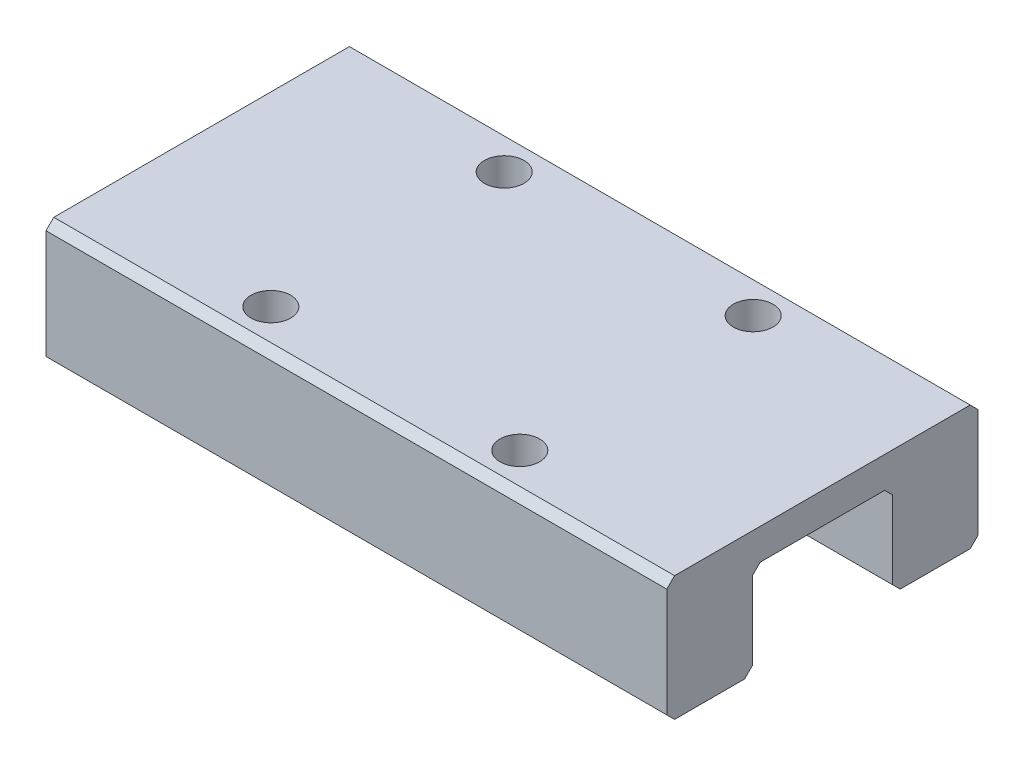
ISO-10303-21;
HEADER;
FILE_DESCRIPTION(('STEP AP214'),'2;1');
FILE_NAME('part.step','',(''),(''),'','','');
FILE_SCHEMA(('AUTOMOTIVE_DESIGN { 1 0 10303 214 1 1 1 1 }'));
ENDSEC;
DATA;
#1=APPLICATION_CONTEXT('core data for automotive mechanical design processes');
#2=APPLICATION_PROTOCOL_DEFINITION('international standard','automotive_design',2000,#1);
#3=PRODUCT_CONTEXT('',#1,'mechanical');
#4=PRODUCT('Part','Part','',(#3));
#5=PRODUCT_RELATED_PRODUCT_CATEGORY('part','',(#4));
#6=PRODUCT_DEFINITION_FORMATION('','',#4);
#7=PRODUCT_DEFINITION_CONTEXT('part definition',#1,'design');
#8=PRODUCT_DEFINITION('design','',#6,#7);
#9=PRODUCT_DEFINITION_SHAPE('','',#8);
#10=(LENGTH_UNIT() NAMED_UNIT(*) SI_UNIT(.MILLI.,.METRE.));
#11=(NAMED_UNIT(*) PLANE_ANGLE_UNIT() SI_UNIT($,.RADIAN.));
#12=(NAMED_UNIT(*) SI_UNIT($,.STERADIAN.) SOLID_ANGLE_UNIT());
#13=UNCERTAINTY_MEASURE_WITH_UNIT(LENGTH_MEASURE(1.E-05),#10,'distance_accuracy_value','');
#14=(GEOMETRIC_REPRESENTATION_CONTEXT(3) GLOBAL_UNCERTAINTY_ASSIGNED_CONTEXT((#13)) GLOBAL_UNIT_ASSIGNED_CONTEXT((#10,
#11,#12)) REPRESENTATION_CONTEXT('',''));
#15=CARTESIAN_POINT('',(0.,0.,0.));
#16=DIRECTION('',(0.,0.,1.));
#17=DIRECTION('',(1.,0.,0.));
#18=AXIS2_PLACEMENT_3D('',#15,#16,#17);
#19=CARTESIAN_POINT('',(39.9,-5.99999999999997,4.50000000000001));
#20=DIRECTION('',(0.,1.,0.));
#21=DIRECTION('',(0.,0.,1.));
#22=AXIS2_PLACEMENT_3D('',#19,#20,#21);
#23=PLANE('',#22);
#24=DIRECTION('',(0.,0.,-1.));
#25=VECTOR('',#24,1.);
#26=CARTESIAN_POINT('',(39.9,-5.99999999999997,4.50000000000001));
#27=LINE('',#26,#25);
#28=CARTESIAN_POINT('',(39.9,-5.99999999999998,9.50000000000002));
#29=VERTEX_POINT('',#28);
#30=CARTESIAN_POINT('',(39.9,-5.99999999999997,5.00000000000001));
#31=VERTEX_POINT('',#30);
#32=EDGE_CURVE('E198',#29,#31,#27,.T.);
#33=ORIENTED_EDGE('',*,*,#32,.F.);
#34=DIRECTION('',(-1.,0.,0.));
#35=VECTOR('',#34,1.);
#36=CARTESIAN_POINT('',(39.9,-5.99999999999998,9.50000000000002));
#37=LINE('',#36,#35);
#38=CARTESIAN_POINT('',(0.,-5.99999999999998,9.50000000000002));
#39=VERTEX_POINT('',#38);
#40=EDGE_CURVE('E239',#29,#39,#37,.T.);
#41=ORIENTED_EDGE('',*,*,#40,.T.);
#42=DIRECTION('',(0.,0.,-1.));
#43=VECTOR('',#42,1.);
#44=CARTESIAN_POINT('',(0.,-5.99999999999997,4.50000000000001));
#45=LINE('',#44,#43);
#46=CARTESIAN_POINT('',(0.,-5.99999999999997,5.00000000000001));
#47=VERTEX_POINT('',#46);
#48=EDGE_CURVE('E184',#39,#47,#45,.T.);
#49=ORIENTED_EDGE('',*,*,#48,.T.);
#50=DIRECTION('',(1.,0.,0.));
#51=VECTOR('',#50,1.);
#52=CARTESIAN_POINT('',(39.9,-5.99999999999997,5.00000000000001));
#53=LINE('',#52,#51);
#54=EDGE_CURVE('E237',#47,#31,#53,.T.);
#55=ORIENTED_EDGE('',*,*,#54,.T.);
#56=EDGE_LOOP('',(#33,#41,#49,#55));
#57=FACE_BOUND('',#56,.T.);
#58=ADVANCED_FACE('F37',(#57),#23,.F.);
#59=CARTESIAN_POINT('',(39.9,0.,4.50000000000001));
#60=DIRECTION('',(0.,0.,1.));
#61=DIRECTION('',(1.,0.,0.));
#62=AXIS2_PLACEMENT_3D('',#59,#60,#61);
#63=PLANE('',#62);
#64=DIRECTION('',(0.,1.,0.));
#65=VECTOR('',#64,1.);
#66=CARTESIAN_POINT('',(0.,0.,4.50000000000001));
#67=LINE('',#66,#65);
#68=CARTESIAN_POINT('',(0.,-5.49999999999997,4.50000000000001));
#69=VERTEX_POINT('',#68);
#70=CARTESIAN_POINT('',(0.,-0.499999999999967,4.50000000000001));
#71=VERTEX_POINT('',#70);
#72=EDGE_CURVE('E179',#69,#71,#67,.T.);
#73=ORIENTED_EDGE('',*,*,#72,.T.);
#74=DIRECTION('',(1.,0.,0.));
#75=VECTOR('',#74,1.);
#76=CARTESIAN_POINT('',(39.9,-0.499999999999967,4.50000000000001));
#77=LINE('',#76,#75);
#78=CARTESIAN_POINT('',(39.9,-0.499999999999967,4.50000000000001));
#79=VERTEX_POINT('',#78);
#80=EDGE_CURVE('E156',#71,#79,#77,.T.);
#81=ORIENTED_EDGE('',*,*,#80,.T.);
#82=DIRECTION('',(0.,1.,0.));
#83=VECTOR('',#82,1.);
#84=CARTESIAN_POINT('',(39.9,0.,4.50000000000001));
#85=LINE('',#84,#83);
#86=CARTESIAN_POINT('',(39.9,-5.49999999999997,4.50000000000001));
#87=VERTEX_POINT('',#86);
#88=EDGE_CURVE('E260',#87,#79,#85,.T.);
#89=ORIENTED_EDGE('',*,*,#88,.F.);
#90=DIRECTION('',(-1.,0.,0.));
#91=VECTOR('',#90,1.);
#92=CARTESIAN_POINT('',(39.9,-5.49999999999997,4.50000000000001));
#93=LINE('',#92,#91);
#94=EDGE_CURVE('E172',#87,#69,#93,.T.);
#95=ORIENTED_EDGE('',*,*,#94,.T.);
#96=EDGE_LOOP('',(#73,#81,#89,#95));
#97=FACE_BOUND('',#96,.T.);
#98=ADVANCED_FACE('F374',(#97),#63,.F.);
#99=CARTESIAN_POINT('',(39.9,0.,4.50000000000001));
#100=DIRECTION('',(0.,1.,0.));
#101=DIRECTION('',(0.,0.,1.));
#102=AXIS2_PLACEMENT_3D('',#99,#100,#101);
#103=PLANE('',#102);
#104=DIRECTION('',(0.,0.,-1.));
#105=VECTOR('',#104,1.);
#106=CARTESIAN_POINT('',(39.9,0.,4.50000000000001));
#107=LINE('',#106,#105);
#108=CARTESIAN_POINT('',(39.9,0.,4.00000000000001));
#109=VERTEX_POINT('',#108);
#110=CARTESIAN_POINT('',(39.9,0.,-4.00000000000001));
#111=VERTEX_POINT('',#110);
#112=EDGE_CURVE('E171',#109,#111,#107,.T.);
#113=ORIENTED_EDGE('',*,*,#112,.F.);
#114=DIRECTION('',(-1.,0.,0.));
#115=VECTOR('',#114,1.);
#116=CARTESIAN_POINT('',(0.,0.,4.00000000000001));
#117=LINE('',#116,#115);
#118=CARTESIAN_POINT('',(0.,0.,4.00000000000001));
#119=VERTEX_POINT('',#118);
#120=EDGE_CURVE('E155',#109,#119,#117,.T.);
#121=ORIENTED_EDGE('',*,*,#120,.T.);
#122=DIRECTION('',(0.,0.,-1.));
#123=VECTOR('',#122,1.);
#124=CARTESIAN_POINT('',(0.,0.,4.50000000000001));
#125=LINE('',#124,#123);
#126=CARTESIAN_POINT('',(0.,0.,-4.00000000000001));
#127=VERTEX_POINT('',#126);
#128=EDGE_CURVE('E168',#119,#127,#125,.T.);
#129=ORIENTED_EDGE('',*,*,#128,.T.);
#130=DIRECTION('',(1.,0.,0.));
#131=VECTOR('',#130,1.);
#132=CARTESIAN_POINT('',(39.9,0.,-4.00000000000001));
#133=LINE('',#132,#131);
#134=EDGE_CURVE('E173',#127,#111,#133,.T.);
#135=ORIENTED_EDGE('',*,*,#134,.T.);
#136=EDGE_LOOP('',(#113,#121,#129,#135));
#137=FACE_BOUND('',#136,.T.);
#138=ADVANCED_FACE('F167',(#137),#103,.F.);
#139=CARTESIAN_POINT('',(39.9,0.,-4.50000000000001));
#140=DIRECTION('',(0.,0.,-1.));
#141=DIRECTION('',(-1.,0.,0.));
#142=AXIS2_PLACEMENT_3D('',#139,#140,#141);
#143=PLANE('',#142);
#144=DIRECTION('',(0.,-1.,0.));
#145=VECTOR('',#144,1.);
#146=CARTESIAN_POINT('',(0.,0.,-4.50000000000001));
#147=LINE('',#146,#145);
#148=CARTESIAN_POINT('',(0.,-0.499999999999999,-4.50000000000001));
#149=VERTEX_POINT('',#148);
#150=CARTESIAN_POINT('',(0.,-5.5,-4.50000000000001));
#151=VERTEX_POINT('',#150);
#152=EDGE_CURVE('E178',#149,#151,#147,.T.);
#153=ORIENTED_EDGE('',*,*,#152,.T.);
#154=DIRECTION('',(1.,0.,0.));
#155=VECTOR('',#154,1.);
#156=CARTESIAN_POINT('',(39.9,-5.5,-4.50000000000001));
#157=LINE('',#156,#155);
#158=CARTESIAN_POINT('',(39.9,-5.5,-4.50000000000001));
#159=VERTEX_POINT('',#158);
#160=EDGE_CURVE('E224',#151,#159,#157,.T.);
#161=ORIENTED_EDGE('',*,*,#160,.T.);
#162=DIRECTION('',(0.,-1.,0.));
#163=VECTOR('',#162,1.);
#164=CARTESIAN_POINT('',(39.9,0.,-4.50000000000001));
#165=LINE('',#164,#163);
#166=CARTESIAN_POINT('',(39.9,-0.499999999999999,-4.50000000000001));
#167=VERTEX_POINT('',#166);
#168=EDGE_CURVE('E266',#167,#159,#165,.T.);
#169=ORIENTED_EDGE('',*,*,#168,.F.);
#170=DIRECTION('',(-1.,0.,0.));
#171=VECTOR('',#170,1.);
#172=CARTESIAN_POINT('',(0.,-0.499999999999999,-4.50000000000001));
#173=LINE('',#172,#171);
#174=EDGE_CURVE('E221',#167,#149,#173,.T.);
#175=ORIENTED_EDGE('',*,*,#174,.T.);
#176=EDGE_LOOP('',(#153,#161,#169,#175));
#177=FACE_BOUND('',#176,.T.);
#178=ADVANCED_FACE('F357',(#177),#143,.F.);
#179=CARTESIAN_POINT('',(39.9,-6.,-4.50000000000001));
#180=DIRECTION('',(0.,1.,0.));
#181=DIRECTION('',(0.,0.,1.));
#182=AXIS2_PLACEMENT_3D('',#179,#180,#181);
#183=PLANE('',#182);
#184=DIRECTION('',(0.,0.,-1.));
#185=VECTOR('',#184,1.);
#186=CARTESIAN_POINT('',(39.9,-6.,-4.50000000000001));
#187=LINE('',#186,#185);
#188=CARTESIAN_POINT('',(39.9,-6.,-5.00000000000001));
#189=VERTEX_POINT('',#188);
#190=CARTESIAN_POINT('',(39.9,-6.,-9.50000000000001));
#191=VERTEX_POINT('',#190);
#192=EDGE_CURVE('E272',#189,#191,#187,.T.);
#193=ORIENTED_EDGE('',*,*,#192,.F.);
#194=DIRECTION('',(-1.,0.,0.));
#195=VECTOR('',#194,1.);
#196=CARTESIAN_POINT('',(39.9,-6.,-5.00000000000001));
#197=LINE('',#196,#195);
#198=CARTESIAN_POINT('',(0.,-6.,-5.00000000000001));
#199=VERTEX_POINT('',#198);
#200=EDGE_CURVE('E206',#189,#199,#197,.T.);
#201=ORIENTED_EDGE('',*,*,#200,.T.);
#202=DIRECTION('',(0.,0.,-1.));
#203=VECTOR('',#202,1.);
#204=CARTESIAN_POINT('',(0.,-6.,-4.50000000000001));
#205=LINE('',#204,#203);
#206=CARTESIAN_POINT('',(0.,-6.,-9.50000000000001));
#207=VERTEX_POINT('',#206);
#208=EDGE_CURVE('E182',#199,#207,#205,.T.);
#209=ORIENTED_EDGE('',*,*,#208,.T.);
#210=DIRECTION('',(1.,0.,0.));
#211=VECTOR('',#210,1.);
#212=CARTESIAN_POINT('',(39.9,-6.,-9.50000000000001));
#213=LINE('',#212,#211);
#214=EDGE_CURVE('E204',#207,#191,#213,.T.);
#215=ORIENTED_EDGE('',*,*,#214,.T.);
#216=EDGE_LOOP('',(#193,#201,#209,#215));
#217=FACE_BOUND('',#216,.T.);
#218=ADVANCED_FACE('F350',(#217),#183,.F.);
#219=CARTESIAN_POINT('',(39.9,-6.00000000000001,-10.));
#220=DIRECTION('',(0.,0.,1.));
#221=DIRECTION('',(1.,0.,0.));
#222=AXIS2_PLACEMENT_3D('',#219,#220,#221);
#223=PLANE('',#222);
#224=DIRECTION('',(0.,1.,0.));
#225=VECTOR('',#224,1.);
#226=CARTESIAN_POINT('',(39.9,-6.00000000000001,-10.));
#227=LINE('',#226,#225);
#228=CARTESIAN_POINT('',(39.9,-5.5,-10.));
#229=VERTEX_POINT('',#228);
#230=CARTESIAN_POINT('',(39.9,1.49999999999999,-10.));
#231=VERTEX_POINT('',#230);
#232=EDGE_CURVE('E275',#229,#231,#227,.T.);
#233=ORIENTED_EDGE('',*,*,#232,.F.);
#234=DIRECTION('',(-1.,0.,0.));
#235=VECTOR('',#234,1.);
#236=CARTESIAN_POINT('',(39.9,-5.5,-10.));
#237=LINE('',#236,#235);
#238=CARTESIAN_POINT('',(0.,-5.5,-10.));
#239=VERTEX_POINT('',#238);
#240=EDGE_CURVE('E248',#229,#239,#237,.T.);
#241=ORIENTED_EDGE('',*,*,#240,.T.);
#242=DIRECTION('',(0.,1.,0.));
#243=VECTOR('',#242,1.);
#244=CARTESIAN_POINT('',(0.,-6.00000000000001,-10.));
#245=LINE('',#244,#243);
#246=CARTESIAN_POINT('',(0.,1.49999999999999,-10.));
#247=VERTEX_POINT('',#246);
#248=EDGE_CURVE('E190',#239,#247,#245,.T.);
#249=ORIENTED_EDGE('',*,*,#248,.T.);
#250=DIRECTION('',(1.,0.,0.));
#251=VECTOR('',#250,1.);
#252=CARTESIAN_POINT('',(39.9,1.49999999999999,-10.));
#253=LINE('',#252,#251);
#254=EDGE_CURVE('E246',#247,#231,#253,.T.);
#255=ORIENTED_EDGE('',*,*,#254,.T.);
#256=EDGE_LOOP('',(#233,#241,#249,#255));
#257=FACE_BOUND('',#256,.T.);
#258=ADVANCED_FACE('F324',(#257),#223,.F.);
#259=CARTESIAN_POINT('',(39.9,2.,-10.));
#260=DIRECTION('',(0.,-1.,0.));
#261=DIRECTION('',(0.,0.,-1.));
#262=AXIS2_PLACEMENT_3D('',#259,#260,#261);
#263=PLANE('',#262);
#264=CARTESIAN_POINT('',(11.95,2.00000000000002,7.5));
#265=DIRECTION('',(0.,1.,0.));
#266=DIRECTION('',(0.,0.,-1.));
#267=AXIS2_PLACEMENT_3D('',#264,#265,#266);
#268=CIRCLE('',#267,1.275);
#269=CARTESIAN_POINT('',(11.95,2.00000000000002,6.225));
#270=VERTEX_POINT('',#269);
#271=EDGE_CURVE('E305',#270,#270,#268,.T.);
#272=ORIENTED_EDGE('',*,*,#271,.F.);
#273=EDGE_LOOP('',(#272));
#274=FACE_BOUND('',#273,.T.);
#275=CARTESIAN_POINT('',(27.95,2.00000000000002,7.5));
#276=DIRECTION('',(0.,1.,0.));
#277=DIRECTION('',(0.,0.,1.));
#278=AXIS2_PLACEMENT_3D('',#275,#276,#277);
#279=CIRCLE('',#278,1.275);
#280=CARTESIAN_POINT('',(27.95,2.00000000000002,8.775));
#281=VERTEX_POINT('',#280);
#282=EDGE_CURVE('E299',#281,#281,#279,.T.);
#283=ORIENTED_EDGE('',*,*,#282,.F.);
#284=EDGE_LOOP('',(#283));
#285=FACE_BOUND('',#284,.T.);
#286=CARTESIAN_POINT('',(27.95,2.,-7.5));
#287=DIRECTION('',(0.,1.,0.));
#288=DIRECTION('',(0.,0.,-1.));
#289=AXIS2_PLACEMENT_3D('',#286,#287,#288);
#290=CIRCLE('',#289,1.275);
#291=CARTESIAN_POINT('',(27.95,2.,-8.775));
#292=VERTEX_POINT('',#291);
#293=EDGE_CURVE('E293',#292,#292,#290,.T.);
#294=ORIENTED_EDGE('',*,*,#293,.F.);
#295=EDGE_LOOP('',(#294));
#296=FACE_BOUND('',#295,.T.);
#297=CARTESIAN_POINT('',(11.95,2.,-7.5));
#298=DIRECTION('',(0.,1.,0.));
#299=DIRECTION('',(0.,0.,1.));
#300=AXIS2_PLACEMENT_3D('',#297,#298,#299);
#301=CIRCLE('',#300,1.275);
#302=CARTESIAN_POINT('',(11.95,2.,-6.225));
#303=VERTEX_POINT('',#302);
#304=EDGE_CURVE('E286',#303,#303,#301,.T.);
#305=ORIENTED_EDGE('',*,*,#304,.F.);
#306=EDGE_LOOP('',(#305));
#307=FACE_BOUND('',#306,.T.);
#308=DIRECTION('',(0.,0.,1.));
#309=VECTOR('',#308,1.);
#310=CARTESIAN_POINT('',(39.9,2.,-10.));
#311=LINE('',#310,#309);
#312=CARTESIAN_POINT('',(39.9,2.,-9.5));
#313=VERTEX_POINT('',#312);
#314=CARTESIAN_POINT('',(39.9,2.00000000000002,9.50000000000001));
#315=VERTEX_POINT('',#314);
#316=EDGE_CURVE('E278',#313,#315,#311,.T.);
#317=ORIENTED_EDGE('',*,*,#316,.F.);
#318=DIRECTION('',(-1.,0.,0.));
#319=VECTOR('',#318,1.);
#320=CARTESIAN_POINT('',(39.9,2.,-9.5));
#321=LINE('',#320,#319);
#322=CARTESIAN_POINT('',(0.,2.,-9.5));
#323=VERTEX_POINT('',#322);
#324=EDGE_CURVE('E162',#313,#323,#321,.T.);
#325=ORIENTED_EDGE('',*,*,#324,.T.);
#326=DIRECTION('',(0.,0.,1.));
#327=VECTOR('',#326,1.);
#328=CARTESIAN_POINT('',(0.,2.,-10.));
#329=LINE('',#328,#327);
#330=CARTESIAN_POINT('',(0.,2.00000000000002,9.50000000000001));
#331=VERTEX_POINT('',#330);
#332=EDGE_CURVE('E193',#323,#331,#329,.T.);
#333=ORIENTED_EDGE('',*,*,#332,.T.);
#334=DIRECTION('',(1.,0.,0.));
#335=VECTOR('',#334,1.);
#336=CARTESIAN_POINT('',(39.9,2.00000000000002,9.50000000000001));
#337=LINE('',#336,#335);
#338=EDGE_CURVE('E251',#331,#315,#337,.T.);
#339=ORIENTED_EDGE('',*,*,#338,.T.);
#340=EDGE_LOOP('',(#317,#325,#333,#339));
#341=FACE_BOUND('',#340,.T.);
#342=ADVANCED_FACE('F320',(#274,#285,#296,#307,#341),#263,.F.);
#343=CARTESIAN_POINT('',(39.9,-5.99999999999998,10.));
#344=DIRECTION('',(0.,0.,-1.));
#345=DIRECTION('',(-1.,0.,0.));
#346=AXIS2_PLACEMENT_3D('',#343,#344,#345);
#347=PLANE('',#346);
#348=DIRECTION('',(0.,-1.,0.));
#349=VECTOR('',#348,1.);
#350=CARTESIAN_POINT('',(0.,-5.99999999999998,10.));
#351=LINE('',#350,#349);
#352=CARTESIAN_POINT('',(0.,1.50000000000002,10.));
#353=VERTEX_POINT('',#352);
#354=CARTESIAN_POINT('',(0.,-5.49999999999998,10.));
#355=VERTEX_POINT('',#354);
#356=EDGE_CURVE('E196',#353,#355,#351,.T.);
#357=ORIENTED_EDGE('',*,*,#356,.T.);
#358=DIRECTION('',(1.,0.,0.));
#359=VECTOR('',#358,1.);
#360=CARTESIAN_POINT('',(39.9,-5.49999999999998,10.));
#361=LINE('',#360,#359);
#362=CARTESIAN_POINT('',(39.9,-5.49999999999998,10.));
#363=VERTEX_POINT('',#362);
#364=EDGE_CURVE('E52',#355,#363,#361,.T.);
#365=ORIENTED_EDGE('',*,*,#364,.T.);
#366=DIRECTION('',(0.,-1.,0.));
#367=VECTOR('',#366,1.);
#368=CARTESIAN_POINT('',(39.9,-5.99999999999998,10.));
#369=LINE('',#368,#367);
#370=CARTESIAN_POINT('',(39.9,1.50000000000002,10.));
#371=VERTEX_POINT('',#370);
#372=EDGE_CURVE('E199',#371,#363,#369,.T.);
#373=ORIENTED_EDGE('',*,*,#372,.F.);
#374=DIRECTION('',(-1.,0.,0.));
#375=VECTOR('',#374,1.);
#376=CARTESIAN_POINT('',(39.9,1.50000000000002,10.));
#377=LINE('',#376,#375);
#378=EDGE_CURVE('E242',#371,#353,#377,.T.);
#379=ORIENTED_EDGE('',*,*,#378,.T.);
#380=EDGE_LOOP('',(#357,#365,#373,#379));
#381=FACE_BOUND('',#380,.T.);
#382=ADVANCED_FACE('F323',(#381),#347,.F.);
#383=CARTESIAN_POINT('',(39.9,-5.99999999999998,10.));
#384=DIRECTION('',(-1.,0.,0.));
#385=DIRECTION('',(0.,0.,1.));
#386=AXIS2_PLACEMENT_3D('',#383,#384,#385);
#387=PLANE('',#386);
#388=ORIENTED_EDGE('',*,*,#168,.T.);
#389=DIRECTION('',(0.,0.707106781186548,0.707106781186547));
#390=VECTOR('',#389,1.);
#391=CARTESIAN_POINT('',(39.9,-6.,-5.00000000000001));
#392=LINE('',#391,#390);
#393=EDGE_CURVE('E235',#159,#189,#392,.F.);
#394=ORIENTED_EDGE('',*,*,#393,.T.);
#395=ORIENTED_EDGE('',*,*,#192,.T.);
#396=DIRECTION('',(0.,-0.707106781186548,0.707106781186548));
#397=VECTOR('',#396,1.);
#398=CARTESIAN_POINT('',(39.9,-5.5,-10.));
#399=LINE('',#398,#397);
#400=EDGE_CURVE('E229',#191,#229,#399,.F.);
#401=ORIENTED_EDGE('',*,*,#400,.T.);
#402=ORIENTED_EDGE('',*,*,#232,.T.);
#403=DIRECTION('',(0.,-0.707106781186548,-0.707106781186547));
#404=VECTOR('',#403,1.);
#405=CARTESIAN_POINT('',(39.9,2.,-9.5));
#406=LINE('',#405,#404);
#407=EDGE_CURVE('E227',#231,#313,#406,.F.);
#408=ORIENTED_EDGE('',*,*,#407,.T.);
#409=ORIENTED_EDGE('',*,*,#316,.T.);
#410=DIRECTION('',(0.,0.707106781186547,-0.707106781186548));
#411=VECTOR('',#410,1.);
#412=CARTESIAN_POINT('',(39.9,1.50000000000002,10.));
#413=LINE('',#412,#411);
#414=EDGE_CURVE('E59',#315,#371,#413,.F.);
#415=ORIENTED_EDGE('',*,*,#414,.T.);
#416=ORIENTED_EDGE('',*,*,#372,.T.);
#417=DIRECTION('',(0.,0.707106781186548,0.707106781186548));
#418=VECTOR('',#417,1.);
#419=CARTESIAN_POINT('',(39.9,-5.99999999999998,9.50000000000002));
#420=LINE('',#419,#418);
#421=EDGE_CURVE('E233',#363,#29,#420,.F.);
#422=ORIENTED_EDGE('',*,*,#421,.T.);
#423=ORIENTED_EDGE('',*,*,#32,.T.);
#424=DIRECTION('',(0.,-0.707106781186548,0.707106781186548));
#425=VECTOR('',#424,1.);
#426=CARTESIAN_POINT('',(39.9,-5.49999999999997,4.50000000000001));
#427=LINE('',#426,#425);
#428=EDGE_CURVE('E231',#31,#87,#427,.F.);
#429=ORIENTED_EDGE('',*,*,#428,.T.);
#430=ORIENTED_EDGE('',*,*,#88,.T.);
#431=DIRECTION('',(0.,-0.707106781186543,0.707106781186552));
#432=VECTOR('',#431,1.);
#433=CARTESIAN_POINT('',(39.9,-5.99999999999994,10.));
#434=LINE('',#433,#432);
#435=EDGE_CURVE('E161',#79,#109,#434,.F.);
#436=ORIENTED_EDGE('',*,*,#435,.T.);
#437=ORIENTED_EDGE('',*,*,#112,.T.);
#438=DIRECTION('',(0.,0.707106781186552,0.707106781186543));
#439=VECTOR('',#438,1.);
#440=CARTESIAN_POINT('',(39.9,3.99999999999998,0.));
#441=LINE('',#440,#439);
#442=EDGE_CURVE('E11',#111,#167,#441,.F.);
#443=ORIENTED_EDGE('',*,*,#442,.T.);
#444=EDGE_LOOP('',(#388,#394,#395,#401,#402,#408,#409,#415,#416,#422,#423,#429,#430,#436,#437,#443));
#445=FACE_BOUND('',#444,.T.);
#446=ADVANCED_FACE('F257',(#445),#387,.F.);
#447=CARTESIAN_POINT('',(0.,-5.99999999999998,10.));
#448=DIRECTION('',(-1.,0.,0.));
#449=DIRECTION('',(0.,0.,1.));
#450=AXIS2_PLACEMENT_3D('',#447,#448,#449);
#451=PLANE('',#450);
#452=ORIENTED_EDGE('',*,*,#208,.F.);
#453=DIRECTION('',(0.,-0.707106781186548,-0.707106781186547));
#454=VECTOR('',#453,1.);
#455=CARTESIAN_POINT('',(0.,1.50000000000002,2.5));
#456=LINE('',#455,#454);
#457=EDGE_CURVE('E219',#199,#151,#456,.F.);
#458=ORIENTED_EDGE('',*,*,#457,.T.);
#459=ORIENTED_EDGE('',*,*,#152,.F.);
#460=DIRECTION('',(0.,-0.707106781186552,-0.707106781186543));
#461=VECTOR('',#460,1.);
#462=CARTESIAN_POINT('',(0.,-0.499999999999999,-4.50000000000001));
#463=LINE('',#462,#461);
#464=EDGE_CURVE('E45',#149,#127,#463,.F.);
#465=ORIENTED_EDGE('',*,*,#464,.T.);
#466=ORIENTED_EDGE('',*,*,#128,.F.);
#467=DIRECTION('',(0.,0.707106781186543,-0.707106781186552));
#468=VECTOR('',#467,1.);
#469=CARTESIAN_POINT('',(0.,0.,4.00000000000001));
#470=LINE('',#469,#468);
#471=EDGE_CURVE('E151',#119,#71,#470,.F.);
#472=ORIENTED_EDGE('',*,*,#471,.T.);
#473=ORIENTED_EDGE('',*,*,#72,.F.);
#474=DIRECTION('',(0.,0.707106781186548,-0.707106781186548));
#475=VECTOR('',#474,1.);
#476=CARTESIAN_POINT('',(0.,-8.49999999999998,7.50000000000001));
#477=LINE('',#476,#475);
#478=EDGE_CURVE('E215',#69,#47,#477,.F.);
#479=ORIENTED_EDGE('',*,*,#478,.T.);
#480=ORIENTED_EDGE('',*,*,#48,.F.);
#481=DIRECTION('',(0.,-0.707106781186548,-0.707106781186548));
#482=VECTOR('',#481,1.);
#483=CARTESIAN_POINT('',(0.,-5.74999999999998,9.75000000000001));
#484=LINE('',#483,#482);
#485=EDGE_CURVE('E217',#39,#355,#484,.F.);
#486=ORIENTED_EDGE('',*,*,#485,.T.);
#487=ORIENTED_EDGE('',*,*,#356,.F.);
#488=DIRECTION('',(0.,-0.707106781186547,0.707106781186548));
#489=VECTOR('',#488,1.);
#490=CARTESIAN_POINT('',(0.,-2.24999999999997,13.75));
#491=LINE('',#490,#489);
#492=EDGE_CURVE('E209',#353,#331,#491,.F.);
#493=ORIENTED_EDGE('',*,*,#492,.T.);
#494=ORIENTED_EDGE('',*,*,#332,.F.);
#495=DIRECTION('',(0.,0.707106781186548,0.707106781186547));
#496=VECTOR('',#495,1.);
#497=CARTESIAN_POINT('',(0.,7.75000000000001,-3.74999999999999));
#498=LINE('',#497,#496);
#499=EDGE_CURVE('E211',#323,#247,#498,.F.);
#500=ORIENTED_EDGE('',*,*,#499,.T.);
#501=ORIENTED_EDGE('',*,*,#248,.F.);
#502=DIRECTION('',(0.,0.707106781186548,-0.707106781186548));
#503=VECTOR('',#502,1.);
#504=CARTESIAN_POINT('',(0.,-15.75,0.249999999999988));
#505=LINE('',#504,#503);
#506=EDGE_CURVE('E213',#239,#207,#505,.F.);
#507=ORIENTED_EDGE('',*,*,#506,.T.);
#508=EDGE_LOOP('',(#452,#458,#459,#465,#466,#472,#473,#479,#480,#486,#487,#493,#494,#500,#501,#507));
#509=FACE_BOUND('',#508,.T.);
#510=ADVANCED_FACE('F176',(#509),#451,.T.);
#511=CARTESIAN_POINT('',(39.9,0.,4.00000000000001));
#512=DIRECTION('',(0.,-0.707106781186552,-0.707106781186543));
#513=DIRECTION('',(0.,0.707106781186543,-0.707106781186552));
#514=AXIS2_PLACEMENT_3D('',#511,#512,#513);
#515=PLANE('',#514);
#516=ORIENTED_EDGE('',*,*,#435,.F.);
#517=ORIENTED_EDGE('',*,*,#80,.F.);
#518=ORIENTED_EDGE('',*,*,#471,.F.);
#519=ORIENTED_EDGE('',*,*,#120,.F.);
#520=EDGE_LOOP('',(#516,#517,#518,#519));
#521=FACE_BOUND('',#520,.T.);
#522=ADVANCED_FACE('F154',(#521),#515,.T.);
#523=CARTESIAN_POINT('',(39.9,-6.,-5.00000000000001));
#524=DIRECTION('',(0.,0.707106781186547,-0.707106781186548));
#525=DIRECTION('',(0.,0.707106781186548,0.707106781186547));
#526=AXIS2_PLACEMENT_3D('',#523,#524,#525);
#527=PLANE('',#526);
#528=ORIENTED_EDGE('',*,*,#393,.F.);
#529=ORIENTED_EDGE('',*,*,#160,.F.);
#530=ORIENTED_EDGE('',*,*,#457,.F.);
#531=ORIENTED_EDGE('',*,*,#200,.F.);
#532=EDGE_LOOP('',(#528,#529,#530,#531));
#533=FACE_BOUND('',#532,.T.);
#534=ADVANCED_FACE('F354',(#533),#527,.F.);
#535=CARTESIAN_POINT('',(39.9,-0.499999999999999,-4.50000000000001));
#536=DIRECTION('',(0.,-0.707106781186543,0.707106781186552));
#537=DIRECTION('',(0.,-0.707106781186552,-0.707106781186543));
#538=AXIS2_PLACEMENT_3D('',#535,#536,#537);
#539=PLANE('',#538);
#540=ORIENTED_EDGE('',*,*,#442,.F.);
#541=ORIENTED_EDGE('',*,*,#134,.F.);
#542=ORIENTED_EDGE('',*,*,#464,.F.);
#543=ORIENTED_EDGE('',*,*,#174,.F.);
#544=EDGE_LOOP('',(#540,#541,#542,#543));
#545=FACE_BOUND('',#544,.T.);
#546=ADVANCED_FACE('F361',(#545),#539,.T.);
#547=CARTESIAN_POINT('',(39.9,-5.99999999999998,9.50000000000002));
#548=DIRECTION('',(0.,0.707106781186547,-0.707106781186547));
#549=DIRECTION('',(0.,0.707106781186548,0.707106781186548));
#550=AXIS2_PLACEMENT_3D('',#547,#548,#549);
#551=PLANE('',#550);
#552=ORIENTED_EDGE('',*,*,#421,.F.);
#553=ORIENTED_EDGE('',*,*,#364,.F.);
#554=ORIENTED_EDGE('',*,*,#485,.F.);
#555=ORIENTED_EDGE('',*,*,#40,.F.);
#556=EDGE_LOOP('',(#552,#553,#554,#555));
#557=FACE_BOUND('',#556,.T.);
#558=ADVANCED_FACE('F363',(#557),#551,.F.);
#559=CARTESIAN_POINT('',(39.9,-5.49999999999997,4.50000000000001));
#560=DIRECTION('',(0.,0.707106781186547,0.707106781186547));
#561=DIRECTION('',(0.,-0.707106781186548,0.707106781186548));
#562=AXIS2_PLACEMENT_3D('',#559,#560,#561);
#563=PLANE('',#562);
#564=ORIENTED_EDGE('',*,*,#428,.F.);
#565=ORIENTED_EDGE('',*,*,#54,.F.);
#566=ORIENTED_EDGE('',*,*,#478,.F.);
#567=ORIENTED_EDGE('',*,*,#94,.F.);
#568=EDGE_LOOP('',(#564,#565,#566,#567));
#569=FACE_BOUND('',#568,.T.);
#570=ADVANCED_FACE('F369',(#569),#563,.F.);
#571=CARTESIAN_POINT('',(39.9,-5.5,-10.));
#572=DIRECTION('',(0.,0.707106781186547,0.707106781186547));
#573=DIRECTION('',(0.,-0.707106781186548,0.707106781186548));
#574=AXIS2_PLACEMENT_3D('',#571,#572,#573);
#575=PLANE('',#574);
#576=ORIENTED_EDGE('',*,*,#400,.F.);
#577=ORIENTED_EDGE('',*,*,#214,.F.);
#578=ORIENTED_EDGE('',*,*,#506,.F.);
#579=ORIENTED_EDGE('',*,*,#240,.F.);
#580=EDGE_LOOP('',(#576,#577,#578,#579));
#581=FACE_BOUND('',#580,.T.);
#582=ADVANCED_FACE('F346',(#581),#575,.F.);
#583=CARTESIAN_POINT('',(39.9,2.,-9.5));
#584=DIRECTION('',(0.,-0.707106781186547,0.707106781186548));
#585=DIRECTION('',(0.,-0.707106781186548,-0.707106781186547));
#586=AXIS2_PLACEMENT_3D('',#583,#584,#585);
#587=PLANE('',#586);
#588=ORIENTED_EDGE('',*,*,#407,.F.);
#589=ORIENTED_EDGE('',*,*,#254,.F.);
#590=ORIENTED_EDGE('',*,*,#499,.F.);
#591=ORIENTED_EDGE('',*,*,#324,.F.);
#592=EDGE_LOOP('',(#588,#589,#590,#591));
#593=FACE_BOUND('',#592,.T.);
#594=ADVANCED_FACE('F338',(#593),#587,.F.);
#595=CARTESIAN_POINT('',(39.9,1.50000000000002,10.));
#596=DIRECTION('',(0.,-0.707106781186548,-0.707106781186547));
#597=DIRECTION('',(0.,0.707106781186547,-0.707106781186548));
#598=AXIS2_PLACEMENT_3D('',#595,#596,#597);
#599=PLANE('',#598);
#600=ORIENTED_EDGE('',*,*,#414,.F.);
#601=ORIENTED_EDGE('',*,*,#338,.F.);
#602=ORIENTED_EDGE('',*,*,#492,.F.);
#603=ORIENTED_EDGE('',*,*,#378,.F.);
#604=EDGE_LOOP('',(#600,#601,#602,#603));
#605=FACE_BOUND('',#604,.T.);
#606=ADVANCED_FACE('F39',(#605),#599,.F.);
#607=CARTESIAN_POINT('',(11.95,-1.,-7.5));
#608=DIRECTION('',(0.,1.,0.));
#609=DIRECTION('',(0.,0.,1.));
#610=AXIS2_PLACEMENT_3D('',#607,#608,#609);
#611=CYLINDRICAL_SURFACE('',#610,1.275);
#612=CARTESIAN_POINT('',(11.95,-1.,-7.5));
#613=DIRECTION('',(0.,1.,0.));
#614=DIRECTION('',(0.,0.,1.));
#615=AXIS2_PLACEMENT_3D('',#612,#613,#614);
#616=CIRCLE('',#615,1.275);
#617=CARTESIAN_POINT('',(11.95,-1.,-6.225));
#618=VERTEX_POINT('',#617);
#619=EDGE_CURVE('E281',#618,#618,#616,.T.);
#620=ORIENTED_EDGE('',*,*,#619,.F.);
#621=EDGE_LOOP('',(#620));
#622=FACE_BOUND('',#621,.T.);
#623=ORIENTED_EDGE('',*,*,#304,.T.);
#624=EDGE_LOOP('',(#623));
#625=FACE_BOUND('',#624,.T.);
#626=ADVANCED_FACE('F487',(#622,#625),#611,.F.);
#627=CARTESIAN_POINT('',(11.95,-1.,-7.5));
#628=DIRECTION('',(0.,1.,0.));
#629=DIRECTION('',(0.,0.,1.));
#630=AXIS2_PLACEMENT_3D('',#627,#628,#629);
#631=PLANE('',#630);
#632=ORIENTED_EDGE('',*,*,#619,.T.);
#633=EDGE_LOOP('',(#632));
#634=FACE_BOUND('',#633,.T.);
#635=ADVANCED_FACE('F497',(#634),#631,.T.);
#636=CARTESIAN_POINT('',(27.95,-1.,-7.5));
#637=DIRECTION('',(0.,1.,0.));
#638=DIRECTION('',(0.,0.,1.));
#639=AXIS2_PLACEMENT_3D('',#636,#637,#638);
#640=CYLINDRICAL_SURFACE('',#639,1.275);
#641=CARTESIAN_POINT('',(27.95,-1.,-7.5));
#642=DIRECTION('',(0.,1.,0.));
#643=DIRECTION('',(0.,0.,-1.));
#644=AXIS2_PLACEMENT_3D('',#641,#642,#643);
#645=CIRCLE('',#644,1.275);
#646=CARTESIAN_POINT('',(27.95,-1.,-8.775));
#647=VERTEX_POINT('',#646);
#648=EDGE_CURVE('E291',#647,#647,#645,.T.);
#649=ORIENTED_EDGE('',*,*,#648,.F.);
#650=EDGE_LOOP('',(#649));
#651=FACE_BOUND('',#650,.T.);
#652=ORIENTED_EDGE('',*,*,#293,.T.);
#653=EDGE_LOOP('',(#652));
#654=FACE_BOUND('',#653,.T.);
#655=ADVANCED_FACE('F504',(#651,#654),#640,.F.);
#656=CARTESIAN_POINT('',(27.95,-1.,-7.5));
#657=DIRECTION('',(0.,-1.,0.));
#658=DIRECTION('',(0.,0.,-1.));
#659=AXIS2_PLACEMENT_3D('',#656,#657,#658);
#660=PLANE('',#659);
#661=ORIENTED_EDGE('',*,*,#648,.T.);
#662=EDGE_LOOP('',(#661));
#663=FACE_BOUND('',#662,.T.);
#664=ADVANCED_FACE('F511',(#663),#660,.F.);
#665=CARTESIAN_POINT('',(27.95,-0.99999999999998,7.5));
#666=DIRECTION('',(0.,1.,0.));
#667=DIRECTION('',(0.,0.,1.));
#668=AXIS2_PLACEMENT_3D('',#665,#666,#667);
#669=CYLINDRICAL_SURFACE('',#668,1.275);
#670=CARTESIAN_POINT('',(27.95,-0.99999999999998,7.5));
#671=DIRECTION('',(0.,1.,0.));
#672=DIRECTION('',(0.,0.,1.));
#673=AXIS2_PLACEMENT_3D('',#670,#671,#672);
#674=CIRCLE('',#673,1.275);
#675=CARTESIAN_POINT('',(27.95,-0.999999999999979,8.775));
#676=VERTEX_POINT('',#675);
#677=EDGE_CURVE('E296',#676,#676,#674,.T.);
#678=ORIENTED_EDGE('',*,*,#677,.F.);
#679=EDGE_LOOP('',(#678));
#680=FACE_BOUND('',#679,.T.);
#681=ORIENTED_EDGE('',*,*,#282,.T.);
#682=EDGE_LOOP('',(#681));
#683=FACE_BOUND('',#682,.T.);
#684=ADVANCED_FACE('F519',(#680,#683),#669,.F.);
#685=CARTESIAN_POINT('',(27.95,-0.99999999999998,7.5));
#686=DIRECTION('',(0.,1.,0.));
#687=DIRECTION('',(0.,0.,1.));
#688=AXIS2_PLACEMENT_3D('',#685,#686,#687);
#689=PLANE('',#688);
#690=ORIENTED_EDGE('',*,*,#677,.T.);
#691=EDGE_LOOP('',(#690));
#692=FACE_BOUND('',#691,.T.);
#693=ADVANCED_FACE('F316',(#692),#689,.T.);
#694=CARTESIAN_POINT('',(11.95,-0.99999999999998,7.5));
#695=DIRECTION('',(0.,1.,0.));
#696=DIRECTION('',(0.,0.,1.));
#697=AXIS2_PLACEMENT_3D('',#694,#695,#696);
#698=CYLINDRICAL_SURFACE('',#697,1.275);
#699=CARTESIAN_POINT('',(11.95,-0.99999999999998,7.5));
#700=DIRECTION('',(0.,1.,0.));
#701=DIRECTION('',(0.,0.,-1.));
#702=AXIS2_PLACEMENT_3D('',#699,#700,#701);
#703=CIRCLE('',#702,1.275);
#704=CARTESIAN_POINT('',(11.95,-0.999999999999982,6.225));
#705=VERTEX_POINT('',#704);
#706=EDGE_CURVE('E302',#705,#705,#703,.T.);
#707=ORIENTED_EDGE('',*,*,#706,.F.);
#708=EDGE_LOOP('',(#707));
#709=FACE_BOUND('',#708,.T.);
#710=ORIENTED_EDGE('',*,*,#271,.T.);
#711=EDGE_LOOP('',(#710));
#712=FACE_BOUND('',#711,.T.);
#713=ADVANCED_FACE('F313',(#709,#712),#698,.F.);
#714=CARTESIAN_POINT('',(11.95,-0.99999999999998,7.5));
#715=DIRECTION('',(0.,-1.,0.));
#716=DIRECTION('',(0.,0.,-1.));
#717=AXIS2_PLACEMENT_3D('',#714,#715,#716);
#718=PLANE('',#717);
#719=ORIENTED_EDGE('',*,*,#706,.T.);
#720=EDGE_LOOP('',(#719));
#721=FACE_BOUND('',#720,.T.);
#722=ADVANCED_FACE('F311',(#721),#718,.F.);
#723=CLOSED_SHELL('',(#58,#98,#138,#178,#218,#258,#342,#382,#446,#510,#522,#534,#546,#558,#570,
#582,#594,#606,#626,#635,#655,#664,#684,#693,#713,#722));
#724=MANIFOLD_SOLID_BREP('B2',#723);
#725=ADVANCED_BREP_SHAPE_REPRESENTATION('',(#18,#724),#14);
#726=SHAPE_DEFINITION_REPRESENTATION(#9,#725);
ENDSEC;
END-ISO-10303-21;
